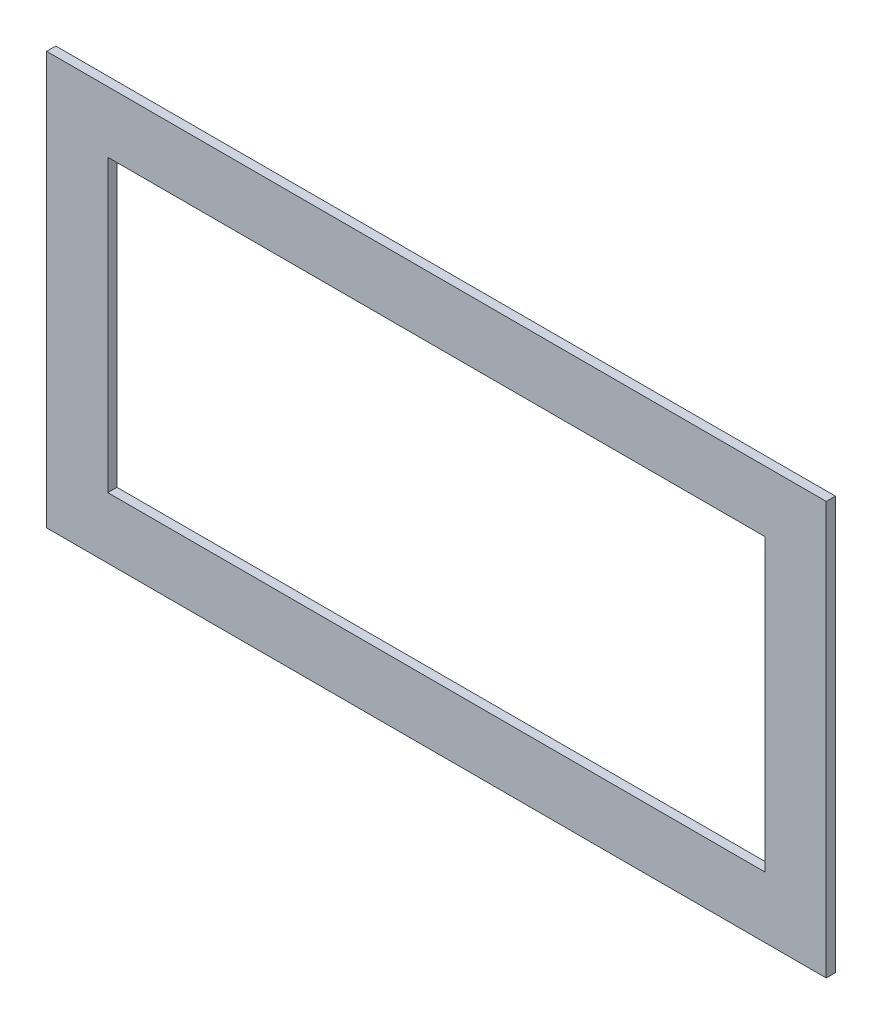
ISO-10303-21;
HEADER;
FILE_DESCRIPTION(('STEP AP214'),'2;1');
FILE_NAME('part.step','',(''),(''),'','','');
FILE_SCHEMA(('AUTOMOTIVE_DESIGN { 1 0 10303 214 1 1 1 1 }'));
ENDSEC;
DATA;
#1=APPLICATION_CONTEXT('core data for automotive mechanical design processes');
#2=APPLICATION_PROTOCOL_DEFINITION('international standard','automotive_design',2000,#1);
#3=PRODUCT_CONTEXT('',#1,'mechanical');
#4=PRODUCT('Part','Part','',(#3));
#5=PRODUCT_RELATED_PRODUCT_CATEGORY('part','',(#4));
#6=PRODUCT_DEFINITION_FORMATION('','',#4);
#7=PRODUCT_DEFINITION_CONTEXT('part definition',#1,'design');
#8=PRODUCT_DEFINITION('design','',#6,#7);
#9=PRODUCT_DEFINITION_SHAPE('','',#8);
#10=(LENGTH_UNIT() NAMED_UNIT(*) SI_UNIT(.MILLI.,.METRE.));
#11=(NAMED_UNIT(*) PLANE_ANGLE_UNIT() SI_UNIT($,.RADIAN.));
#12=(NAMED_UNIT(*) SI_UNIT($,.STERADIAN.) SOLID_ANGLE_UNIT());
#13=UNCERTAINTY_MEASURE_WITH_UNIT(LENGTH_MEASURE(1.E-05),#10,'distance_accuracy_value','');
#14=(GEOMETRIC_REPRESENTATION_CONTEXT(3) GLOBAL_UNCERTAINTY_ASSIGNED_CONTEXT((#13)) GLOBAL_UNIT_ASSIGNED_CONTEXT((#10,
#11,#12)) REPRESENTATION_CONTEXT('',''));
#15=CARTESIAN_POINT('',(0.,0.,0.));
#16=DIRECTION('',(0.,0.,1.));
#17=DIRECTION('',(1.,0.,0.));
#18=AXIS2_PLACEMENT_3D('',#15,#16,#17);
#19=CARTESIAN_POINT('',(0.,0.,3.));
#20=DIRECTION('',(0.,0.,-1.));
#21=DIRECTION('',(-1.,0.,0.));
#22=AXIS2_PLACEMENT_3D('',#19,#20,#21);
#23=PLANE('',#22);
#24=DIRECTION('',(-1.,0.,0.));
#25=VECTOR('',#24,1.);
#26=CARTESIAN_POINT('',(-250.,130.,3.));
#27=LINE('',#26,#25);
#28=CARTESIAN_POINT('',(5.00000000000015,130.,3.));
#29=VERTEX_POINT('',#28);
#30=CARTESIAN_POINT('',(-250.,130.,3.));
#31=VERTEX_POINT('',#30);
#32=EDGE_CURVE('E134',#29,#31,#27,.T.);
#33=ORIENTED_EDGE('',*,*,#32,.T.);
#34=DIRECTION('',(4.90348502543036E-13,-1.,0.));
#35=VECTOR('',#34,1.);
#36=CARTESIAN_POINT('',(-250.,130.,3.));
#37=LINE('',#36,#35);
#38=CARTESIAN_POINT('',(-250.,-5.00000000000004,3.));
#39=VERTEX_POINT('',#38);
#40=EDGE_CURVE('E137',#31,#39,#37,.T.);
#41=ORIENTED_EDGE('',*,*,#40,.T.);
#42=DIRECTION('',(1.,0.,0.));
#43=VECTOR('',#42,1.);
#44=CARTESIAN_POINT('',(5.00000000000012,-5.00000000000003,3.));
#45=LINE('',#44,#43);
#46=CARTESIAN_POINT('',(5.00000000000012,-5.00000000000003,3.));
#47=VERTEX_POINT('',#46);
#48=EDGE_CURVE('E140',#39,#47,#45,.T.);
#49=ORIENTED_EDGE('',*,*,#48,.T.);
#50=DIRECTION('',(0.,1.,0.));
#51=VECTOR('',#50,1.);
#52=CARTESIAN_POINT('',(4.99999999999983,-2.00000000000199,3.));
#53=LINE('',#52,#51);
#54=EDGE_CURVE('E142',#47,#29,#53,.T.);
#55=ORIENTED_EDGE('',*,*,#54,.T.);
#56=EDGE_LOOP('',(#33,#41,#49,#55));
#57=FACE_BOUND('',#56,.T.);
#58=DIRECTION('',(0.,1.,0.));
#59=VECTOR('',#58,1.);
#60=CARTESIAN_POINT('',(-14.9999999999999,110.,3.));
#61=LINE('',#60,#59);
#62=CARTESIAN_POINT('',(-14.9999999999999,15.,3.));
#63=VERTEX_POINT('',#62);
#64=CARTESIAN_POINT('',(-14.9999999999999,110.,3.));
#65=VERTEX_POINT('',#64);
#66=EDGE_CURVE('E98',#63,#65,#61,.T.);
#67=ORIENTED_EDGE('',*,*,#66,.F.);
#68=DIRECTION('',(1.,0.,0.));
#69=VECTOR('',#68,1.);
#70=CARTESIAN_POINT('',(-14.9999999999999,15.,3.));
#71=LINE('',#70,#69);
#72=CARTESIAN_POINT('',(-230.,15.,3.));
#73=VERTEX_POINT('',#72);
#74=EDGE_CURVE('E120',#73,#63,#71,.T.);
#75=ORIENTED_EDGE('',*,*,#74,.F.);
#76=DIRECTION('',(0.,-1.,0.));
#77=VECTOR('',#76,1.);
#78=CARTESIAN_POINT('',(-230.,110.,3.));
#79=LINE('',#78,#77);
#80=CARTESIAN_POINT('',(-230.,110.,3.));
#81=VERTEX_POINT('',#80);
#82=EDGE_CURVE('E118',#81,#73,#79,.T.);
#83=ORIENTED_EDGE('',*,*,#82,.F.);
#84=DIRECTION('',(-1.,0.,0.));
#85=VECTOR('',#84,1.);
#86=CARTESIAN_POINT('',(-14.9999999999999,110.,3.));
#87=LINE('',#86,#85);
#88=EDGE_CURVE('E106',#65,#81,#87,.T.);
#89=ORIENTED_EDGE('',*,*,#88,.F.);
#90=EDGE_LOOP('',(#67,#75,#83,#89));
#91=FACE_BOUND('',#90,.T.);
#92=ADVANCED_FACE('F33',(#57,#91),#23,.F.);
#93=CARTESIAN_POINT('',(0.,0.,0.));
#94=DIRECTION('',(0.,0.,-1.));
#95=DIRECTION('',(-1.,0.,0.));
#96=AXIS2_PLACEMENT_3D('',#93,#94,#95);
#97=PLANE('',#96);
#98=DIRECTION('',(-1.,0.,0.));
#99=VECTOR('',#98,1.);
#100=CARTESIAN_POINT('',(-250.,130.,0.));
#101=LINE('',#100,#99);
#102=CARTESIAN_POINT('',(5.00000000000015,130.,0.));
#103=VERTEX_POINT('',#102);
#104=CARTESIAN_POINT('',(-250.,130.,0.));
#105=VERTEX_POINT('',#104);
#106=EDGE_CURVE('E114',#103,#105,#101,.T.);
#107=ORIENTED_EDGE('',*,*,#106,.F.);
#108=DIRECTION('',(-4.9439619065306E-13,1.,0.));
#109=VECTOR('',#108,1.);
#110=CARTESIAN_POINT('',(5.00000000000015,130.,0.));
#111=LINE('',#110,#109);
#112=CARTESIAN_POINT('',(5.00000000000012,-5.00000000000003,0.));
#113=VERTEX_POINT('',#112);
#114=EDGE_CURVE('E138',#113,#103,#111,.T.);
#115=ORIENTED_EDGE('',*,*,#114,.F.);
#116=DIRECTION('',(1.,0.,0.));
#117=VECTOR('',#116,1.);
#118=CARTESIAN_POINT('',(5.00000000000012,-5.00000000000003,0.));
#119=LINE('',#118,#117);
#120=CARTESIAN_POINT('',(-250.,-5.00000000000004,0.));
#121=VERTEX_POINT('',#120);
#122=EDGE_CURVE('E149',#121,#113,#119,.T.);
#123=ORIENTED_EDGE('',*,*,#122,.F.);
#124=DIRECTION('',(0.,-1.,0.));
#125=VECTOR('',#124,1.);
#126=CARTESIAN_POINT('',(-250.,-2.00000000000004,0.));
#127=LINE('',#126,#125);
#128=EDGE_CURVE('E147',#105,#121,#127,.T.);
#129=ORIENTED_EDGE('',*,*,#128,.F.);
#130=EDGE_LOOP('',(#107,#115,#123,#129));
#131=FACE_BOUND('',#130,.T.);
#132=DIRECTION('',(1.,0.,0.));
#133=VECTOR('',#132,1.);
#134=CARTESIAN_POINT('',(-14.9999999999999,15.,0.));
#135=LINE('',#134,#133);
#136=CARTESIAN_POINT('',(-230.,15.,0.));
#137=VERTEX_POINT('',#136);
#138=CARTESIAN_POINT('',(-14.9999999999999,15.,0.));
#139=VERTEX_POINT('',#138);
#140=EDGE_CURVE('E107',#137,#139,#135,.T.);
#141=ORIENTED_EDGE('',*,*,#140,.T.);
#142=DIRECTION('',(0.,1.,0.));
#143=VECTOR('',#142,1.);
#144=CARTESIAN_POINT('',(-14.9999999999999,110.,0.));
#145=LINE('',#144,#143);
#146=CARTESIAN_POINT('',(-14.9999999999999,110.,0.));
#147=VERTEX_POINT('',#146);
#148=EDGE_CURVE('E56',#139,#147,#145,.T.);
#149=ORIENTED_EDGE('',*,*,#148,.T.);
#150=DIRECTION('',(-1.,0.,0.));
#151=VECTOR('',#150,1.);
#152=CARTESIAN_POINT('',(-14.9999999999999,110.,0.));
#153=LINE('',#152,#151);
#154=CARTESIAN_POINT('',(-230.,110.,0.));
#155=VERTEX_POINT('',#154);
#156=EDGE_CURVE('E113',#147,#155,#153,.T.);
#157=ORIENTED_EDGE('',*,*,#156,.T.);
#158=DIRECTION('',(0.,-1.,0.));
#159=VECTOR('',#158,1.);
#160=CARTESIAN_POINT('',(-230.,110.,0.));
#161=LINE('',#160,#159);
#162=EDGE_CURVE('E126',#155,#137,#161,.T.);
#163=ORIENTED_EDGE('',*,*,#162,.T.);
#164=EDGE_LOOP('',(#141,#149,#157,#163));
#165=FACE_BOUND('',#164,.T.);
#166=ADVANCED_FACE('F167',(#131,#165),#97,.T.);
#167=CARTESIAN_POINT('',(-250.,130.,3.));
#168=DIRECTION('',(0.,-1.,0.));
#169=DIRECTION('',(1.,0.,0.));
#170=AXIS2_PLACEMENT_3D('',#167,#168,#169);
#171=PLANE('',#170);
#172=ORIENTED_EDGE('',*,*,#106,.T.);
#173=DIRECTION('',(0.,0.,-1.));
#174=VECTOR('',#173,1.);
#175=CARTESIAN_POINT('',(-250.,130.,3.));
#176=LINE('',#175,#174);
#177=EDGE_CURVE('E11',#31,#105,#176,.T.);
#178=ORIENTED_EDGE('',*,*,#177,.F.);
#179=ORIENTED_EDGE('',*,*,#32,.F.);
#180=DIRECTION('',(0.,0.,-1.));
#181=VECTOR('',#180,1.);
#182=CARTESIAN_POINT('',(5.00000000000015,130.,3.));
#183=LINE('',#182,#181);
#184=EDGE_CURVE('E144',#29,#103,#183,.T.);
#185=ORIENTED_EDGE('',*,*,#184,.T.);
#186=EDGE_LOOP('',(#172,#178,#179,#185));
#187=FACE_BOUND('',#186,.T.);
#188=ADVANCED_FACE('F35',(#187),#171,.F.);
#189=CARTESIAN_POINT('',(-250.,-2.00000000000004,3.));
#190=DIRECTION('',(1.,0.,0.));
#191=DIRECTION('',(0.,1.,0.));
#192=AXIS2_PLACEMENT_3D('',#189,#190,#191);
#193=PLANE('',#192);
#194=ORIENTED_EDGE('',*,*,#128,.T.);
#195=DIRECTION('',(0.,0.,-1.));
#196=VECTOR('',#195,1.);
#197=CARTESIAN_POINT('',(-250.,-5.00000000000004,3.));
#198=LINE('',#197,#196);
#199=EDGE_CURVE('E41',#39,#121,#198,.T.);
#200=ORIENTED_EDGE('',*,*,#199,.F.);
#201=ORIENTED_EDGE('',*,*,#40,.F.);
#202=ORIENTED_EDGE('',*,*,#177,.T.);
#203=EDGE_LOOP('',(#194,#200,#201,#202));
#204=FACE_BOUND('',#203,.T.);
#205=ADVANCED_FACE('F177',(#204),#193,.F.);
#206=CARTESIAN_POINT('',(5.00000000000012,-5.00000000000003,3.));
#207=DIRECTION('',(0.,1.,0.));
#208=DIRECTION('',(-1.,0.,0.));
#209=AXIS2_PLACEMENT_3D('',#206,#207,#208);
#210=PLANE('',#209);
#211=ORIENTED_EDGE('',*,*,#122,.T.);
#212=DIRECTION('',(0.,0.,-1.));
#213=VECTOR('',#212,1.);
#214=CARTESIAN_POINT('',(5.00000000000012,-5.00000000000003,3.));
#215=LINE('',#214,#213);
#216=EDGE_CURVE('E155',#47,#113,#215,.T.);
#217=ORIENTED_EDGE('',*,*,#216,.F.);
#218=ORIENTED_EDGE('',*,*,#48,.F.);
#219=ORIENTED_EDGE('',*,*,#199,.T.);
#220=EDGE_LOOP('',(#211,#217,#218,#219));
#221=FACE_BOUND('',#220,.T.);
#222=ADVANCED_FACE('F162',(#221),#210,.F.);
#223=CARTESIAN_POINT('',(5.00000000000015,130.,3.));
#224=DIRECTION('',(-1.,-4.9439619065306E-13,0.));
#225=DIRECTION('',(4.9439619065306E-13,-1.,0.));
#226=AXIS2_PLACEMENT_3D('',#223,#224,#225);
#227=PLANE('',#226);
#228=ORIENTED_EDGE('',*,*,#114,.T.);
#229=ORIENTED_EDGE('',*,*,#184,.F.);
#230=ORIENTED_EDGE('',*,*,#54,.F.);
#231=ORIENTED_EDGE('',*,*,#216,.T.);
#232=EDGE_LOOP('',(#228,#229,#230,#231));
#233=FACE_BOUND('',#232,.T.);
#234=ADVANCED_FACE('F171',(#233),#227,.F.);
#235=CARTESIAN_POINT('',(-14.9999999999999,110.,3.));
#236=DIRECTION('',(-1.,0.,0.));
#237=DIRECTION('',(0.,-1.,0.));
#238=AXIS2_PLACEMENT_3D('',#235,#236,#237);
#239=PLANE('',#238);
#240=ORIENTED_EDGE('',*,*,#148,.F.);
#241=DIRECTION('',(0.,0.,-1.));
#242=VECTOR('',#241,1.);
#243=CARTESIAN_POINT('',(-14.9999999999999,15.,3.));
#244=LINE('',#243,#242);
#245=EDGE_CURVE('E102',#63,#139,#244,.T.);
#246=ORIENTED_EDGE('',*,*,#245,.F.);
#247=ORIENTED_EDGE('',*,*,#66,.T.);
#248=DIRECTION('',(0.,0.,-1.));
#249=VECTOR('',#248,1.);
#250=CARTESIAN_POINT('',(-14.9999999999999,110.,3.));
#251=LINE('',#250,#249);
#252=EDGE_CURVE('E101',#65,#147,#251,.T.);
#253=ORIENTED_EDGE('',*,*,#252,.T.);
#254=EDGE_LOOP('',(#240,#246,#247,#253));
#255=FACE_BOUND('',#254,.T.);
#256=ADVANCED_FACE('F100',(#255),#239,.T.);
#257=CARTESIAN_POINT('',(-14.9999999999999,110.,3.));
#258=DIRECTION('',(0.,-1.,0.));
#259=DIRECTION('',(1.,0.,0.));
#260=AXIS2_PLACEMENT_3D('',#257,#258,#259);
#261=PLANE('',#260);
#262=ORIENTED_EDGE('',*,*,#156,.F.);
#263=ORIENTED_EDGE('',*,*,#252,.F.);
#264=ORIENTED_EDGE('',*,*,#88,.T.);
#265=DIRECTION('',(0.,0.,-1.));
#266=VECTOR('',#265,1.);
#267=CARTESIAN_POINT('',(-230.,110.,3.));
#268=LINE('',#267,#266);
#269=EDGE_CURVE('E115',#81,#155,#268,.T.);
#270=ORIENTED_EDGE('',*,*,#269,.T.);
#271=EDGE_LOOP('',(#262,#263,#264,#270));
#272=FACE_BOUND('',#271,.T.);
#273=ADVANCED_FACE('F110',(#272),#261,.T.);
#274=CARTESIAN_POINT('',(-230.,110.,3.));
#275=DIRECTION('',(1.,0.,0.));
#276=DIRECTION('',(0.,0.,-1.));
#277=AXIS2_PLACEMENT_3D('',#274,#275,#276);
#278=PLANE('',#277);
#279=ORIENTED_EDGE('',*,*,#162,.F.);
#280=ORIENTED_EDGE('',*,*,#269,.F.);
#281=ORIENTED_EDGE('',*,*,#82,.T.);
#282=DIRECTION('',(0.,0.,-1.));
#283=VECTOR('',#282,1.);
#284=CARTESIAN_POINT('',(-230.,15.,3.));
#285=LINE('',#284,#283);
#286=EDGE_CURVE('E48',#73,#137,#285,.T.);
#287=ORIENTED_EDGE('',*,*,#286,.T.);
#288=EDGE_LOOP('',(#279,#280,#281,#287));
#289=FACE_BOUND('',#288,.T.);
#290=ADVANCED_FACE('F200',(#289),#278,.T.);
#291=CARTESIAN_POINT('',(-14.9999999999999,15.,3.));
#292=DIRECTION('',(0.,1.,0.));
#293=DIRECTION('',(-1.,0.,0.));
#294=AXIS2_PLACEMENT_3D('',#291,#292,#293);
#295=PLANE('',#294);
#296=ORIENTED_EDGE('',*,*,#140,.F.);
#297=ORIENTED_EDGE('',*,*,#286,.F.);
#298=ORIENTED_EDGE('',*,*,#74,.T.);
#299=ORIENTED_EDGE('',*,*,#245,.T.);
#300=EDGE_LOOP('',(#296,#297,#298,#299));
#301=FACE_BOUND('',#300,.T.);
#302=ADVANCED_FACE('F204',(#301),#295,.T.);
#303=CLOSED_SHELL('',(#92,#166,#188,#205,#222,#234,#256,#273,#290,#302));
#304=MANIFOLD_SOLID_BREP('B2',#303);
#305=ADVANCED_BREP_SHAPE_REPRESENTATION('',(#18,#304),#14);
#306=SHAPE_DEFINITION_REPRESENTATION(#9,#305);
ENDSEC;
END-ISO-10303-21;
